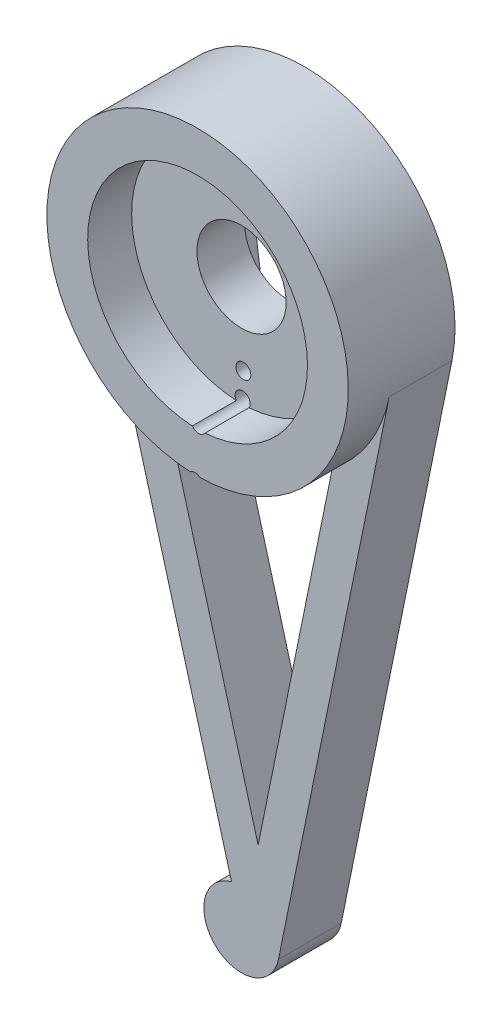
ISO-10303-21;
HEADER;
FILE_DESCRIPTION(('STEP AP214'),'2;1');
FILE_NAME('part.step','',(''),(''),'','','');
FILE_SCHEMA(('AUTOMOTIVE_DESIGN { 1 0 10303 214 1 1 1 1 }'));
ENDSEC;
DATA;
#1=APPLICATION_CONTEXT('core data for automotive mechanical design processes');
#2=APPLICATION_PROTOCOL_DEFINITION('international standard','automotive_design',2000,#1);
#3=PRODUCT_CONTEXT('',#1,'mechanical');
#4=PRODUCT('Part','Part','',(#3));
#5=PRODUCT_RELATED_PRODUCT_CATEGORY('part','',(#4));
#6=PRODUCT_DEFINITION_FORMATION('','',#4);
#7=PRODUCT_DEFINITION_CONTEXT('part definition',#1,'design');
#8=PRODUCT_DEFINITION('design','',#6,#7);
#9=PRODUCT_DEFINITION_SHAPE('','',#8);
#10=(LENGTH_UNIT() NAMED_UNIT(*) SI_UNIT(.MILLI.,.METRE.));
#11=(NAMED_UNIT(*) PLANE_ANGLE_UNIT() SI_UNIT($,.RADIAN.));
#12=(NAMED_UNIT(*) SI_UNIT($,.STERADIAN.) SOLID_ANGLE_UNIT());
#13=UNCERTAINTY_MEASURE_WITH_UNIT(LENGTH_MEASURE(1.E-05),#10,'distance_accuracy_value','');
#14=(GEOMETRIC_REPRESENTATION_CONTEXT(3) GLOBAL_UNCERTAINTY_ASSIGNED_CONTEXT((#13)) GLOBAL_UNIT_ASSIGNED_CONTEXT((#10,
#11,#12)) REPRESENTATION_CONTEXT('',''));
#15=CARTESIAN_POINT('',(0.,0.,0.));
#16=DIRECTION('',(0.,0.,1.));
#17=DIRECTION('',(1.,0.,0.));
#18=AXIS2_PLACEMENT_3D('',#15,#16,#17);
#19=CARTESIAN_POINT('',(0.,0.,5.));
#20=DIRECTION('',(0.,0.,1.));
#21=DIRECTION('',(1.,0.,0.));
#22=AXIS2_PLACEMENT_3D('',#19,#20,#21);
#23=PLANE('',#22);
#24=CARTESIAN_POINT('',(-0.20026757996282,-12.4483891687404,5.));
#25=DIRECTION('',(0.,0.,1.));
#26=DIRECTION('',(1.,0.,0.));
#27=AXIS2_PLACEMENT_3D('',#24,#25,#26);
#28=CIRCLE('',#27,0.600000000000014);
#29=CARTESIAN_POINT('',(0.352635662624541,-12.2153698469312,5.));
#30=VERTEX_POINT('',#29);
#31=CARTESIAN_POINT('',(0.196595474620813,-11.9983894843999,5.));
#32=VERTEX_POINT('',#31);
#33=EDGE_CURVE('E327',#30,#32,#28,.T.);
#34=ORIENTED_EDGE('',*,*,#33,.F.);
#35=CARTESIAN_POINT('',(0.272467701428492,-1.63402512428662,5.));
#36=DIRECTION('',(0.,0.,-1.));
#37=DIRECTION('',(1.,0.,0.));
#38=AXIS2_PLACEMENT_3D('',#35,#36,#37);
#39=CIRCLE('',#38,10.5816484085156);
#40=CARTESIAN_POINT('',(7.22345623636612,-9.61243608315601,5.));
#41=VERTEX_POINT('',#40);
#42=EDGE_CURVE('E225',#41,#30,#39,.T.);
#43=ORIENTED_EDGE('',*,*,#42,.F.);
#44=DIRECTION('',(0.2,0.979795897113271,0.));
#45=VECTOR('',#44,1.);
#46=CARTESIAN_POINT('',(1.32147916649086,-38.5261006727579,5.));
#47=LINE('',#46,#45);
#48=CARTESIAN_POINT('',(1.32147916649086,-38.5261006727579,5.));
#49=VERTEX_POINT('',#48);
#50=EDGE_CURVE('E220',#49,#41,#47,.T.);
#51=ORIENTED_EDGE('',*,*,#50,.F.);
#52=DIRECTION('',(0.266666666666667,-0.963788819653397,0.));
#53=VECTOR('',#52,1.);
#54=CARTESIAN_POINT('',(-6.67852083350914,-9.61243608315601,5.));
#55=LINE('',#54,#53);
#56=CARTESIAN_POINT('',(-6.5574983280289,-10.0498365995621,5.));
#57=VERTEX_POINT('',#56);
#58=EDGE_CURVE('E221',#57,#49,#55,.T.);
#59=ORIENTED_EDGE('',*,*,#58,.F.);
#60=CARTESIAN_POINT('',(0.,0.,5.));
#61=DIRECTION('',(0.,0.,1.));
#62=DIRECTION('',(1.,0.,0.));
#63=AXIS2_PLACEMENT_3D('',#60,#61,#62);
#64=CIRCLE('',#63,12.);
#65=CARTESIAN_POINT('',(-11.5654658358408,-3.2,5.));
#66=VERTEX_POINT('',#65);
#67=EDGE_CURVE('E175',#66,#57,#64,.T.);
#68=ORIENTED_EDGE('',*,*,#67,.F.);
#69=DIRECTION('',(0.266666666666667,-0.963788819653397,0.));
#70=VECTOR('',#69,1.);
#71=CARTESIAN_POINT('',(-11.5654658358408,-3.2,5.));
#72=LINE('',#71,#70);
#73=CARTESIAN_POINT('',(-0.799999999999995,-42.1086335410398,5.));
#74=VERTEX_POINT('',#73);
#75=EDGE_CURVE('E247',#66,#74,#72,.T.);
#76=ORIENTED_EDGE('',*,*,#75,.T.);
#77=CARTESIAN_POINT('',(0.,-45.,5.));
#78=DIRECTION('',(0.,0.,1.));
#79=DIRECTION('',(1.,0.,0.));
#80=AXIS2_PLACEMENT_3D('',#77,#78,#79);
#81=CIRCLE('',#80,3.);
#82=CARTESIAN_POINT('',(2.93938769133982,-45.6,5.));
#83=VERTEX_POINT('',#82);
#84=EDGE_CURVE('E249',#74,#83,#81,.T.);
#85=ORIENTED_EDGE('',*,*,#84,.T.);
#86=DIRECTION('',(0.2,0.979795897113271,0.));
#87=VECTOR('',#86,1.);
#88=CARTESIAN_POINT('',(2.93938769133982,-45.6,5.));
#89=LINE('',#88,#87);
#90=CARTESIAN_POINT('',(11.7575507653593,-2.4,5.));
#91=VERTEX_POINT('',#90);
#92=EDGE_CURVE('E252',#83,#91,#89,.T.);
#93=ORIENTED_EDGE('',*,*,#92,.T.);
#94=EDGE_CURVE('E178',#32,#91,#64,.T.);
#95=ORIENTED_EDGE('',*,*,#94,.F.);
#96=EDGE_LOOP('',(#34,#43,#51,#59,#68,#76,#85,#93,#95));
#97=FACE_BOUND('',#96,.T.);
#98=ADVANCED_FACE('F34',(#97),#23,.T.);
#99=CARTESIAN_POINT('',(0.272467701428492,-1.63402512428662,5.));
#100=DIRECTION('',(0.,0.,-1.));
#101=DIRECTION('',(-1.,0.,0.));
#102=AXIS2_PLACEMENT_3D('',#99,#100,#101);
#103=CYLINDRICAL_SURFACE('',#102,10.5816484085156);
#104=DIRECTION('',(0.,0.,-1.));
#105=VECTOR('',#104,1.);
#106=CARTESIAN_POINT('',(-0.730728392479646,-12.1680120541536,4.25));
#107=LINE('',#106,#105);
#108=CARTESIAN_POINT('',(-0.730728392479647,-12.1680120541536,5.));
#109=VERTEX_POINT('',#108);
#110=CARTESIAN_POINT('',(-0.730728392479643,-12.1680120541536,1.2));
#111=VERTEX_POINT('',#110);
#112=EDGE_CURVE('E322',#109,#111,#107,.T.);
#113=ORIENTED_EDGE('',*,*,#112,.F.);
#114=CARTESIAN_POINT('',(-4.01235483443582,-11.3093328133263,5.));
#115=VERTEX_POINT('',#114);
#116=EDGE_CURVE('E229',#109,#115,#39,.T.);
#117=ORIENTED_EDGE('',*,*,#116,.T.);
#118=CARTESIAN_POINT('',(-6.67852083350914,-9.61243608315601,5.));
#119=VERTEX_POINT('',#118);
#120=EDGE_CURVE('E224',#115,#119,#39,.T.);
#121=ORIENTED_EDGE('',*,*,#120,.T.);
#122=DIRECTION('',(0.,0.,-1.));
#123=VECTOR('',#122,1.);
#124=CARTESIAN_POINT('',(-6.67852083350914,-9.61243608315601,5.));
#125=LINE('',#124,#123);
#126=CARTESIAN_POINT('',(-6.67852083350914,-9.61243608315601,0.));
#127=VERTEX_POINT('',#126);
#128=EDGE_CURVE('E228',#119,#127,#125,.T.);
#129=ORIENTED_EDGE('',*,*,#128,.T.);
#130=CARTESIAN_POINT('',(0.272467701428492,-1.63402512428662,0.));
#131=DIRECTION('',(0.,0.,-1.));
#132=DIRECTION('',(1.,0.,0.));
#133=AXIS2_PLACEMENT_3D('',#130,#131,#132);
#134=CIRCLE('',#133,10.5816484085156);
#135=CARTESIAN_POINT('',(-2.44017887292403,-11.8620665596786,0.));
#136=VERTEX_POINT('',#135);
#137=EDGE_CURVE('E235',#136,#127,#134,.T.);
#138=ORIENTED_EDGE('',*,*,#137,.F.);
#139=DIRECTION('',(0.,0.,-1.));
#140=VECTOR('',#139,1.);
#141=CARTESIAN_POINT('',(-2.44017887292403,-11.8620665596786,5.));
#142=LINE('',#141,#140);
#143=CARTESIAN_POINT('',(-2.44017887292403,-11.8620665596786,1.2));
#144=VERTEX_POINT('',#143);
#145=EDGE_CURVE('E274',#144,#136,#142,.T.);
#146=ORIENTED_EDGE('',*,*,#145,.F.);
#147=CARTESIAN_POINT('',(0.272467701428492,-1.63402512428662,1.2));
#148=DIRECTION('',(0.,0.,-1.));
#149=DIRECTION('',(-1.,0.,0.));
#150=AXIS2_PLACEMENT_3D('',#147,#148,#149);
#151=CIRCLE('',#150,10.5816484085156);
#152=EDGE_CURVE('E209',#144,#111,#151,.F.);
#153=ORIENTED_EDGE('',*,*,#152,.T.);
#154=EDGE_LOOP('',(#113,#117,#121,#129,#138,#146,#153));
#155=FACE_BOUND('',#154,.T.);
#156=ADVANCED_FACE('F321',(#155),#103,.T.);
#157=CARTESIAN_POINT('',(0.141802358091718,-6.41402587353255,5.));
#158=DIRECTION('',(0.,0.,1.));
#159=DIRECTION('',(1.,0.,0.));
#160=AXIS2_PLACEMENT_3D('',#157,#158,#159);
#161=CIRCLE('',#160,0.600000000000014);
#162=CARTESIAN_POINT('',(0.741802358091732,-6.41402587353255,5.));
#163=VERTEX_POINT('',#162);
#164=EDGE_CURVE('E179',#163,#163,#161,.T.);
#165=ORIENTED_EDGE('',*,*,#164,.F.);
#166=EDGE_LOOP('',(#165));
#167=FACE_BOUND('',#166,.T.);
#168=CARTESIAN_POINT('',(0.0861771780077113,-8.41402587353255,5.));
#169=DIRECTION('',(0.,0.,1.));
#170=DIRECTION('',(1.,0.,0.));
#171=AXIS2_PLACEMENT_3D('',#168,#169,#170);
#172=CIRCLE('',#171,0.600000000000013);
#173=CARTESIAN_POINT('',(0.596454671997415,-8.72964729094209,5.));
#174=VERTEX_POINT('',#173);
#175=CARTESIAN_POINT('',(-0.417528705285574,-8.74003259606408,5.));
#176=VERTEX_POINT('',#175);
#177=EDGE_CURVE('E159',#174,#176,#172,.T.);
#178=ORIENTED_EDGE('',*,*,#177,.F.);
#179=CARTESIAN_POINT('',(0.,0.,5.));
#180=DIRECTION('',(0.,0.,1.));
#181=DIRECTION('',(1.,0.,0.));
#182=AXIS2_PLACEMENT_3D('',#179,#180,#181);
#183=CIRCLE('',#182,8.75);
#184=EDGE_CURVE('E172',#174,#176,#183,.T.);
#185=ORIENTED_EDGE('',*,*,#184,.T.);
#186=EDGE_LOOP('',(#178,#185));
#187=FACE_BOUND('',#186,.T.);
#188=CARTESIAN_POINT('',(0.,0.,5.));
#189=DIRECTION('',(0.,0.,1.));
#190=DIRECTION('',(1.,0.,0.));
#191=AXIS2_PLACEMENT_3D('',#188,#189,#190);
#192=CIRCLE('',#191,3.55);
#193=CARTESIAN_POINT('',(3.55,0.,5.));
#194=VERTEX_POINT('',#193);
#195=EDGE_CURVE('E212',#194,#194,#192,.T.);
#196=ORIENTED_EDGE('',*,*,#195,.F.);
#197=EDGE_LOOP('',(#196));
#198=FACE_BOUND('',#197,.T.);
#199=ADVANCED_FACE('F342',(#167,#187,#198),#23,.T.);
#200=CARTESIAN_POINT('',(0.,0.,5.));
#201=DIRECTION('',(0.,0.,-1.));
#202=DIRECTION('',(-1.,0.,0.));
#203=AXIS2_PLACEMENT_3D('',#200,#201,#202);
#204=CYLINDRICAL_SURFACE('',#203,3.55);
#205=ORIENTED_EDGE('',*,*,#195,.T.);
#206=EDGE_LOOP('',(#205));
#207=FACE_BOUND('',#206,.T.);
#208=CARTESIAN_POINT('',(0.,0.,1.2));
#209=DIRECTION('',(0.,0.,-1.));
#210=DIRECTION('',(-1.,0.,0.));
#211=AXIS2_PLACEMENT_3D('',#208,#209,#210);
#212=CIRCLE('',#211,3.55);
#213=CARTESIAN_POINT('',(-3.55,0.,1.2));
#214=VERTEX_POINT('',#213);
#215=EDGE_CURVE('E206',#214,#214,#212,.T.);
#216=ORIENTED_EDGE('',*,*,#215,.T.);
#217=EDGE_LOOP('',(#216));
#218=FACE_BOUND('',#217,.T.);
#219=ADVANCED_FACE('F345',(#207,#218),#204,.F.);
#220=CARTESIAN_POINT('',(-0.582449965671261,-11.9858563330907,5.));
#221=VERTEX_POINT('',#220);
#222=EDGE_CURVE('E326',#221,#109,#28,.T.);
#223=ORIENTED_EDGE('',*,*,#222,.F.);
#224=EDGE_CURVE('E177',#115,#221,#64,.T.);
#225=ORIENTED_EDGE('',*,*,#224,.F.);
#226=ORIENTED_EDGE('',*,*,#116,.F.);
#227=EDGE_LOOP('',(#223,#225,#226));
#228=FACE_BOUND('',#227,.T.);
#229=ADVANCED_FACE('F325',(#228),#23,.T.);
#230=CARTESIAN_POINT('',(0.,0.,0.));
#231=DIRECTION('',(0.,0.,1.));
#232=DIRECTION('',(1.,0.,0.));
#233=AXIS2_PLACEMENT_3D('',#230,#231,#232);
#234=PLANE('',#233);
#235=CARTESIAN_POINT('',(0.,0.,0.));
#236=DIRECTION('',(0.,0.,1.));
#237=DIRECTION('',(1.,0.,0.));
#238=AXIS2_PLACEMENT_3D('',#235,#236,#237);
#239=CIRCLE('',#238,12.);
#240=CARTESIAN_POINT('',(11.7575507653593,-2.4,0.));
#241=VERTEX_POINT('',#240);
#242=CARTESIAN_POINT('',(-11.5654658358408,-3.2,0.));
#243=VERTEX_POINT('',#242);
#244=EDGE_CURVE('E246',#241,#243,#239,.T.);
#245=ORIENTED_EDGE('',*,*,#244,.F.);
#246=DIRECTION('',(0.2,0.979795897113271,0.));
#247=VECTOR('',#246,1.);
#248=CARTESIAN_POINT('',(2.93938769133982,-45.6,0.));
#249=LINE('',#248,#247);
#250=CARTESIAN_POINT('',(2.93938769133982,-45.6,0.));
#251=VERTEX_POINT('',#250);
#252=EDGE_CURVE('E250',#251,#241,#249,.T.);
#253=ORIENTED_EDGE('',*,*,#252,.F.);
#254=CARTESIAN_POINT('',(0.,-45.,0.));
#255=DIRECTION('',(0.,0.,1.));
#256=DIRECTION('',(1.,0.,0.));
#257=AXIS2_PLACEMENT_3D('',#254,#255,#256);
#258=CIRCLE('',#257,3.);
#259=CARTESIAN_POINT('',(-0.799999999999995,-42.1086335410398,0.));
#260=VERTEX_POINT('',#259);
#261=EDGE_CURVE('E260',#260,#251,#258,.T.);
#262=ORIENTED_EDGE('',*,*,#261,.F.);
#263=DIRECTION('',(0.266666666666667,-0.963788819653397,0.));
#264=VECTOR('',#263,1.);
#265=CARTESIAN_POINT('',(-11.5654658358408,-3.2,0.));
#266=LINE('',#265,#264);
#267=EDGE_CURVE('E258',#243,#260,#266,.T.);
#268=ORIENTED_EDGE('',*,*,#267,.F.);
#269=EDGE_LOOP('',(#245,#253,#262,#268));
#270=FACE_BOUND('',#269,.T.);
#271=CARTESIAN_POINT('',(7.22345623636612,-9.61243608315601,0.));
#272=VERTEX_POINT('',#271);
#273=CARTESIAN_POINT('',(2.42229655844765,-11.9949864178621,0.));
#274=VERTEX_POINT('',#273);
#275=EDGE_CURVE('E236',#272,#274,#134,.T.);
#276=ORIENTED_EDGE('',*,*,#275,.T.);
#277=DIRECTION('',(-0.133333333333333,-0.991071249821234,0.));
#278=VECTOR('',#277,1.);
#279=CARTESIAN_POINT('',(1.98214249964247,-15.2666666666667,0.));
#280=LINE('',#279,#278);
#281=CARTESIAN_POINT('',(3.96428499928493,-0.533333333333333,0.));
#282=VERTEX_POINT('',#281);
#283=EDGE_CURVE('E192',#282,#274,#280,.T.);
#284=ORIENTED_EDGE('',*,*,#283,.F.);
#285=CARTESIAN_POINT('',(0.,0.,0.));
#286=DIRECTION('',(0.,0.,-1.));
#287=DIRECTION('',(-1.,0.,0.));
#288=AXIS2_PLACEMENT_3D('',#285,#286,#287);
#289=CIRCLE('',#288,4.);
#290=CARTESIAN_POINT('',(-3.96428499928494,-0.533333333333334,0.));
#291=VERTEX_POINT('',#290);
#292=EDGE_CURVE('E200',#291,#282,#289,.T.);
#293=ORIENTED_EDGE('',*,*,#292,.F.);
#294=DIRECTION('',(-0.133333333333333,0.991071249821234,0.));
#295=VECTOR('',#294,1.);
#296=CARTESIAN_POINT('',(-3.96428499928493,-0.533333333333333,0.));
#297=LINE('',#296,#295);
#298=EDGE_CURVE('E186',#136,#291,#297,.T.);
#299=ORIENTED_EDGE('',*,*,#298,.F.);
#300=ORIENTED_EDGE('',*,*,#137,.T.);
#301=DIRECTION('',(0.266666666666667,-0.963788819653397,0.));
#302=VECTOR('',#301,1.);
#303=CARTESIAN_POINT('',(-6.67852083350914,-9.61243608315601,0.));
#304=LINE('',#303,#302);
#305=CARTESIAN_POINT('',(1.32147916649086,-38.5261006727579,0.));
#306=VERTEX_POINT('',#305);
#307=EDGE_CURVE('E216',#127,#306,#304,.T.);
#308=ORIENTED_EDGE('',*,*,#307,.T.);
#309=DIRECTION('',(0.2,0.979795897113271,0.));
#310=VECTOR('',#309,1.);
#311=CARTESIAN_POINT('',(1.32147916649086,-38.5261006727579,0.));
#312=LINE('',#311,#310);
#313=EDGE_CURVE('E232',#306,#272,#312,.T.);
#314=ORIENTED_EDGE('',*,*,#313,.T.);
#315=EDGE_LOOP('',(#276,#284,#293,#299,#300,#308,#314));
#316=FACE_BOUND('',#315,.T.);
#317=ADVANCED_FACE('F299',(#270,#316),#234,.F.);
#318=CARTESIAN_POINT('',(0.,0.,5.));
#319=DIRECTION('',(0.,0.,-1.));
#320=DIRECTION('',(-1.,0.,0.));
#321=AXIS2_PLACEMENT_3D('',#318,#319,#320);
#322=CYLINDRICAL_SURFACE('',#321,12.);
#323=ORIENTED_EDGE('',*,*,#224,.T.);
#324=DIRECTION('',(0.,0.,-1.));
#325=VECTOR('',#324,1.);
#326=CARTESIAN_POINT('',(-0.58244996567128,-11.9858563330906,4.25));
#327=LINE('',#326,#325);
#328=CARTESIAN_POINT('',(-0.58244996567128,-11.9858563330906,8.5));
#329=VERTEX_POINT('',#328);
#330=EDGE_CURVE('E333',#221,#329,#327,.F.);
#331=ORIENTED_EDGE('',*,*,#330,.T.);
#332=CARTESIAN_POINT('',(0.,0.,8.5));
#333=DIRECTION('',(0.,0.,1.));
#334=DIRECTION('',(1.,0.,0.));
#335=AXIS2_PLACEMENT_3D('',#332,#333,#334);
#336=CIRCLE('',#335,12.);
#337=CARTESIAN_POINT('',(0.196595474620813,-11.9983894843999,8.5));
#338=VERTEX_POINT('',#337);
#339=EDGE_CURVE('E184',#338,#329,#336,.T.);
#340=ORIENTED_EDGE('',*,*,#339,.F.);
#341=DIRECTION('',(0.,0.,-1.));
#342=VECTOR('',#341,1.);
#343=CARTESIAN_POINT('',(0.196595474620832,-11.9983894843999,4.25));
#344=LINE('',#343,#342);
#345=EDGE_CURVE('E50',#338,#32,#344,.T.);
#346=ORIENTED_EDGE('',*,*,#345,.T.);
#347=ORIENTED_EDGE('',*,*,#94,.T.);
#348=DIRECTION('',(0.,0.,-1.));
#349=VECTOR('',#348,1.);
#350=CARTESIAN_POINT('',(11.7575507653593,-2.4,5.));
#351=LINE('',#350,#349);
#352=EDGE_CURVE('E255',#91,#241,#351,.T.);
#353=ORIENTED_EDGE('',*,*,#352,.T.);
#354=ORIENTED_EDGE('',*,*,#244,.T.);
#355=DIRECTION('',(0.,0.,-1.));
#356=VECTOR('',#355,1.);
#357=CARTESIAN_POINT('',(-11.5654658358408,-3.2,5.));
#358=LINE('',#357,#356);
#359=EDGE_CURVE('E271',#66,#243,#358,.T.);
#360=ORIENTED_EDGE('',*,*,#359,.F.);
#361=ORIENTED_EDGE('',*,*,#67,.T.);
#362=EDGE_CURVE('E171',#57,#115,#64,.T.);
#363=ORIENTED_EDGE('',*,*,#362,.T.);
#364=EDGE_LOOP('',(#323,#331,#340,#346,#347,#353,#354,#360,#361,#363));
#365=FACE_BOUND('',#364,.T.);
#366=ADVANCED_FACE('F36',(#365),#322,.T.);
#367=CARTESIAN_POINT('',(-11.5654658358408,-3.2,5.));
#368=DIRECTION('',(0.963788819653397,0.266666666666667,0.));
#369=DIRECTION('',(-0.266666666666667,0.963788819653397,0.));
#370=AXIS2_PLACEMENT_3D('',#367,#368,#369);
#371=PLANE('',#370);
#372=ORIENTED_EDGE('',*,*,#267,.T.);
#373=DIRECTION('',(0.,0.,-1.));
#374=VECTOR('',#373,1.);
#375=CARTESIAN_POINT('',(-0.799999999999995,-42.1086335410398,5.));
#376=LINE('',#375,#374);
#377=EDGE_CURVE('E268',#74,#260,#376,.T.);
#378=ORIENTED_EDGE('',*,*,#377,.F.);
#379=ORIENTED_EDGE('',*,*,#75,.F.);
#380=ORIENTED_EDGE('',*,*,#359,.T.);
#381=EDGE_LOOP('',(#372,#378,#379,#380));
#382=FACE_BOUND('',#381,.T.);
#383=ADVANCED_FACE('F305',(#382),#371,.F.);
#384=CARTESIAN_POINT('',(0.,-45.,5.));
#385=DIRECTION('',(0.,0.,-1.));
#386=DIRECTION('',(-1.,0.,0.));
#387=AXIS2_PLACEMENT_3D('',#384,#385,#386);
#388=CYLINDRICAL_SURFACE('',#387,3.);
#389=ORIENTED_EDGE('',*,*,#261,.T.);
#390=DIRECTION('',(0.,0.,-1.));
#391=VECTOR('',#390,1.);
#392=CARTESIAN_POINT('',(2.93938769133982,-45.6,5.));
#393=LINE('',#392,#391);
#394=EDGE_CURVE('E265',#83,#251,#393,.T.);
#395=ORIENTED_EDGE('',*,*,#394,.F.);
#396=ORIENTED_EDGE('',*,*,#84,.F.);
#397=ORIENTED_EDGE('',*,*,#377,.T.);
#398=EDGE_LOOP('',(#389,#395,#396,#397));
#399=FACE_BOUND('',#398,.T.);
#400=ADVANCED_FACE('F390',(#399),#388,.T.);
#401=CARTESIAN_POINT('',(2.93938769133982,-45.6,5.));
#402=DIRECTION('',(-0.979795897113271,0.2,0.));
#403=DIRECTION('',(-0.2,-0.979795897113271,0.));
#404=AXIS2_PLACEMENT_3D('',#401,#402,#403);
#405=PLANE('',#404);
#406=ORIENTED_EDGE('',*,*,#252,.T.);
#407=ORIENTED_EDGE('',*,*,#352,.F.);
#408=ORIENTED_EDGE('',*,*,#92,.F.);
#409=ORIENTED_EDGE('',*,*,#394,.T.);
#410=EDGE_LOOP('',(#406,#407,#408,#409));
#411=FACE_BOUND('',#410,.T.);
#412=ADVANCED_FACE('F295',(#411),#405,.F.);
#413=CARTESIAN_POINT('',(-6.67852083350914,-9.61243608315601,5.));
#414=DIRECTION('',(0.963788819653397,0.266666666666667,0.));
#415=DIRECTION('',(-0.266666666666667,0.963788819653397,0.));
#416=AXIS2_PLACEMENT_3D('',#413,#414,#415);
#417=PLANE('',#416);
#418=ORIENTED_EDGE('',*,*,#307,.F.);
#419=ORIENTED_EDGE('',*,*,#128,.F.);
#420=EDGE_CURVE('E217',#119,#57,#55,.T.);
#421=ORIENTED_EDGE('',*,*,#420,.T.);
#422=ORIENTED_EDGE('',*,*,#58,.T.);
#423=DIRECTION('',(0.,0.,-1.));
#424=VECTOR('',#423,1.);
#425=CARTESIAN_POINT('',(1.32147916649086,-38.5261006727579,5.));
#426=LINE('',#425,#424);
#427=EDGE_CURVE('E243',#49,#306,#426,.T.);
#428=ORIENTED_EDGE('',*,*,#427,.T.);
#429=EDGE_LOOP('',(#418,#419,#421,#422,#428));
#430=FACE_BOUND('',#429,.T.);
#431=ADVANCED_FACE('F314',(#430),#417,.T.);
#432=CARTESIAN_POINT('',(1.32147916649086,-38.5261006727579,5.));
#433=DIRECTION('',(-0.979795897113271,0.2,0.));
#434=DIRECTION('',(-0.2,-0.979795897113271,0.));
#435=AXIS2_PLACEMENT_3D('',#432,#433,#434);
#436=PLANE('',#435);
#437=ORIENTED_EDGE('',*,*,#313,.F.);
#438=ORIENTED_EDGE('',*,*,#427,.F.);
#439=ORIENTED_EDGE('',*,*,#50,.T.);
#440=DIRECTION('',(0.,0.,-1.));
#441=VECTOR('',#440,1.);
#442=CARTESIAN_POINT('',(7.22345623636612,-9.61243608315601,5.));
#443=LINE('',#442,#441);
#444=EDGE_CURVE('E241',#41,#272,#443,.T.);
#445=ORIENTED_EDGE('',*,*,#444,.T.);
#446=EDGE_LOOP('',(#437,#438,#439,#445));
#447=FACE_BOUND('',#446,.T.);
#448=ADVANCED_FACE('F414',(#447),#436,.T.);
#449=DIRECTION('',(0.,0.,-1.));
#450=VECTOR('',#449,1.);
#451=CARTESIAN_POINT('',(0.352635662624538,-12.2153698469312,4.25));
#452=LINE('',#451,#450);
#453=CARTESIAN_POINT('',(0.352635662624534,-12.2153698469312,1.2));
#454=VERTEX_POINT('',#453);
#455=EDGE_CURVE('E329',#454,#30,#452,.F.);
#456=ORIENTED_EDGE('',*,*,#455,.F.);
#457=CARTESIAN_POINT('',(2.42229655844765,-11.9949864178621,1.2));
#458=VERTEX_POINT('',#457);
#459=EDGE_CURVE('E213',#454,#458,#151,.F.);
#460=ORIENTED_EDGE('',*,*,#459,.T.);
#461=DIRECTION('',(0.,0.,-1.));
#462=VECTOR('',#461,1.);
#463=CARTESIAN_POINT('',(2.42229655844765,-11.9949864178621,5.));
#464=LINE('',#463,#462);
#465=EDGE_CURVE('E278',#274,#458,#464,.F.);
#466=ORIENTED_EDGE('',*,*,#465,.F.);
#467=ORIENTED_EDGE('',*,*,#275,.F.);
#468=ORIENTED_EDGE('',*,*,#444,.F.);
#469=ORIENTED_EDGE('',*,*,#42,.T.);
#470=EDGE_LOOP('',(#456,#460,#466,#467,#468,#469));
#471=FACE_BOUND('',#470,.T.);
#472=ADVANCED_FACE('F377',(#471),#103,.T.);
#473=CARTESIAN_POINT('',(1.98214249964247,-15.2666666666667,1.2));
#474=DIRECTION('',(0.991071249821234,-0.133333333333333,0.));
#475=DIRECTION('',(0.133333333333333,0.991071249821234,0.));
#476=AXIS2_PLACEMENT_3D('',#473,#474,#475);
#477=PLANE('',#476);
#478=ORIENTED_EDGE('',*,*,#465,.T.);
#479=DIRECTION('',(-0.133333333333333,-0.991071249821234,0.));
#480=VECTOR('',#479,1.);
#481=CARTESIAN_POINT('',(1.98214249964247,-15.2666666666667,1.2));
#482=LINE('',#481,#480);
#483=CARTESIAN_POINT('',(3.96428499928493,-0.533333333333333,1.2));
#484=VERTEX_POINT('',#483);
#485=EDGE_CURVE('E195',#484,#458,#482,.T.);
#486=ORIENTED_EDGE('',*,*,#485,.F.);
#487=DIRECTION('',(0.,0.,-1.));
#488=VECTOR('',#487,1.);
#489=CARTESIAN_POINT('',(3.96428499928493,-0.533333333333333,1.2));
#490=LINE('',#489,#488);
#491=EDGE_CURVE('E204',#484,#282,#490,.T.);
#492=ORIENTED_EDGE('',*,*,#491,.T.);
#493=ORIENTED_EDGE('',*,*,#283,.T.);
#494=EDGE_LOOP('',(#478,#486,#492,#493));
#495=FACE_BOUND('',#494,.T.);
#496=ADVANCED_FACE('F428',(#495),#477,.F.);
#497=CARTESIAN_POINT('',(0.,0.,1.2));
#498=DIRECTION('',(0.,0.,-1.));
#499=DIRECTION('',(-1.,0.,0.));
#500=AXIS2_PLACEMENT_3D('',#497,#498,#499);
#501=CYLINDRICAL_SURFACE('',#500,4.);
#502=ORIENTED_EDGE('',*,*,#292,.T.);
#503=ORIENTED_EDGE('',*,*,#491,.F.);
#504=CARTESIAN_POINT('',(0.,0.,1.2));
#505=DIRECTION('',(0.,0.,-1.));
#506=DIRECTION('',(-1.,0.,0.));
#507=AXIS2_PLACEMENT_3D('',#504,#505,#506);
#508=CIRCLE('',#507,4.);
#509=CARTESIAN_POINT('',(-3.96428499928494,-0.533333333333334,1.2));
#510=VERTEX_POINT('',#509);
#511=EDGE_CURVE('E191',#510,#484,#508,.T.);
#512=ORIENTED_EDGE('',*,*,#511,.F.);
#513=DIRECTION('',(0.,0.,-1.));
#514=VECTOR('',#513,1.);
#515=CARTESIAN_POINT('',(-3.96428499928494,-0.533333333333334,1.2));
#516=LINE('',#515,#514);
#517=EDGE_CURVE('E198',#510,#291,#516,.T.);
#518=ORIENTED_EDGE('',*,*,#517,.T.);
#519=EDGE_LOOP('',(#502,#503,#512,#518));
#520=FACE_BOUND('',#519,.T.);
#521=ADVANCED_FACE('F366',(#520),#501,.F.);
#522=CARTESIAN_POINT('',(-3.96428499928493,-0.533333333333333,1.2));
#523=DIRECTION('',(-0.991071249821234,-0.133333333333333,0.));
#524=DIRECTION('',(0.133333333333333,-0.991071249821234,0.));
#525=AXIS2_PLACEMENT_3D('',#522,#523,#524);
#526=PLANE('',#525);
#527=ORIENTED_EDGE('',*,*,#145,.T.);
#528=ORIENTED_EDGE('',*,*,#298,.T.);
#529=ORIENTED_EDGE('',*,*,#517,.F.);
#530=DIRECTION('',(-0.133333333333333,0.991071249821234,0.));
#531=VECTOR('',#530,1.);
#532=CARTESIAN_POINT('',(-3.96428499928493,-0.533333333333333,1.2));
#533=LINE('',#532,#531);
#534=EDGE_CURVE('E189',#144,#510,#533,.T.);
#535=ORIENTED_EDGE('',*,*,#534,.F.);
#536=EDGE_LOOP('',(#527,#528,#529,#535));
#537=FACE_BOUND('',#536,.T.);
#538=ADVANCED_FACE('F357',(#537),#526,.F.);
#539=CARTESIAN_POINT('',(0.,-15.,1.2));
#540=DIRECTION('',(0.,0.,-1.));
#541=DIRECTION('',(-1.,0.,0.));
#542=AXIS2_PLACEMENT_3D('',#539,#540,#541);
#543=PLANE('',#542);
#544=CARTESIAN_POINT('',(0.141802358091718,-6.41402587353255,1.2));
#545=DIRECTION('',(0.,0.,-1.));
#546=DIRECTION('',(-1.,0.,0.));
#547=AXIS2_PLACEMENT_3D('',#544,#545,#546);
#548=CIRCLE('',#547,0.600000000000014);
#549=CARTESIAN_POINT('',(-0.458197641908295,-6.41402587353255,1.2));
#550=VERTEX_POINT('',#549);
#551=EDGE_CURVE('E38',#550,#550,#548,.T.);
#552=ORIENTED_EDGE('',*,*,#551,.F.);
#553=EDGE_LOOP('',(#552));
#554=FACE_BOUND('',#553,.T.);
#555=CARTESIAN_POINT('',(-0.20026757996282,-12.4483891687404,1.2));
#556=DIRECTION('',(0.,0.,-1.));
#557=DIRECTION('',(-1.,0.,0.));
#558=AXIS2_PLACEMENT_3D('',#555,#556,#557);
#559=CIRCLE('',#558,0.600000000000014);
#560=EDGE_CURVE('E532',#111,#454,#559,.T.);
#561=ORIENTED_EDGE('',*,*,#560,.F.);
#562=ORIENTED_EDGE('',*,*,#152,.F.);
#563=ORIENTED_EDGE('',*,*,#534,.T.);
#564=ORIENTED_EDGE('',*,*,#511,.T.);
#565=ORIENTED_EDGE('',*,*,#485,.T.);
#566=ORIENTED_EDGE('',*,*,#459,.F.);
#567=EDGE_LOOP('',(#561,#562,#563,#564,#565,#566));
#568=FACE_BOUND('',#567,.T.);
#569=CARTESIAN_POINT('',(0.0861771780077113,-8.41402587353255,1.2));
#570=DIRECTION('',(0.,0.,-1.));
#571=DIRECTION('',(-1.,0.,0.));
#572=AXIS2_PLACEMENT_3D('',#569,#570,#571);
#573=CIRCLE('',#572,0.600000000000013);
#574=CARTESIAN_POINT('',(-0.513822821992302,-8.41402587353255,1.2));
#575=VERTEX_POINT('',#574);
#576=EDGE_CURVE('E530',#575,#575,#573,.T.);
#577=ORIENTED_EDGE('',*,*,#576,.F.);
#578=EDGE_LOOP('',(#577));
#579=FACE_BOUND('',#578,.T.);
#580=ORIENTED_EDGE('',*,*,#215,.F.);
#581=EDGE_LOOP('',(#580));
#582=FACE_BOUND('',#581,.T.);
#583=ADVANCED_FACE('F355',(#554,#568,#579,#582),#543,.T.);
#584=CARTESIAN_POINT('',(0.,0.,8.5));
#585=DIRECTION('',(0.,0.,1.));
#586=DIRECTION('',(1.,0.,0.));
#587=AXIS2_PLACEMENT_3D('',#584,#585,#586);
#588=PLANE('',#587);
#589=CARTESIAN_POINT('',(-0.20026757996282,-12.4483891687404,8.5));
#590=DIRECTION('',(0.,0.,-1.));
#591=DIRECTION('',(-1.,0.,0.));
#592=AXIS2_PLACEMENT_3D('',#589,#590,#591);
#593=CIRCLE('',#592,0.600000000000014);
#594=EDGE_CURVE('E168',#329,#338,#593,.T.);
#595=ORIENTED_EDGE('',*,*,#594,.T.);
#596=ORIENTED_EDGE('',*,*,#339,.T.);
#597=EDGE_LOOP('',(#595,#596));
#598=FACE_BOUND('',#597,.T.);
#599=CARTESIAN_POINT('',(0.0861771780077113,-8.41402587353255,8.5));
#600=DIRECTION('',(0.,0.,-1.));
#601=DIRECTION('',(-1.,0.,0.));
#602=AXIS2_PLACEMENT_3D('',#599,#600,#601);
#603=CIRCLE('',#602,0.600000000000013);
#604=CARTESIAN_POINT('',(0.596454671997412,-8.72964729094209,8.5));
#605=VERTEX_POINT('',#604);
#606=CARTESIAN_POINT('',(-0.41752870528557,-8.74003259606408,8.5));
#607=VERTEX_POINT('',#606);
#608=EDGE_CURVE('E57',#605,#607,#603,.T.);
#609=ORIENTED_EDGE('',*,*,#608,.T.);
#610=CARTESIAN_POINT('',(0.,0.,8.5));
#611=DIRECTION('',(0.,0.,1.));
#612=DIRECTION('',(1.,0.,0.));
#613=AXIS2_PLACEMENT_3D('',#610,#611,#612);
#614=CIRCLE('',#613,8.75);
#615=EDGE_CURVE('E167',#605,#607,#614,.T.);
#616=ORIENTED_EDGE('',*,*,#615,.F.);
#617=EDGE_LOOP('',(#609,#616));
#618=FACE_BOUND('',#617,.T.);
#619=ADVANCED_FACE('F166',(#598,#618),#588,.T.);
#620=CARTESIAN_POINT('',(0.,0.,5.));
#621=DIRECTION('',(0.,0.,1.));
#622=DIRECTION('',(1.,0.,0.));
#623=AXIS2_PLACEMENT_3D('',#620,#621,#622);
#624=PLANE('',#623);
#625=ORIENTED_EDGE('',*,*,#420,.F.);
#626=ORIENTED_EDGE('',*,*,#120,.F.);
#627=ORIENTED_EDGE('',*,*,#362,.F.);
#628=EDGE_LOOP('',(#625,#626,#627));
#629=FACE_BOUND('',#628,.T.);
#630=ADVANCED_FACE('F317',(#629),#624,.F.);
#631=CARTESIAN_POINT('',(0.,0.,8.5));
#632=DIRECTION('',(0.,0.,-1.));
#633=DIRECTION('',(-1.,0.,0.));
#634=AXIS2_PLACEMENT_3D('',#631,#632,#633);
#635=CYLINDRICAL_SURFACE('',#634,8.75);
#636=DIRECTION('',(0.,0.,-1.));
#637=VECTOR('',#636,1.);
#638=CARTESIAN_POINT('',(-0.417528705285571,-8.74003259606408,4.25));
#639=LINE('',#638,#637);
#640=EDGE_CURVE('E11',#176,#607,#639,.F.);
#641=ORIENTED_EDGE('',*,*,#640,.F.);
#642=ORIENTED_EDGE('',*,*,#184,.F.);
#643=DIRECTION('',(0.,0.,-1.));
#644=VECTOR('',#643,1.);
#645=CARTESIAN_POINT('',(0.596454671997413,-8.72964729094208,4.25));
#646=LINE('',#645,#644);
#647=EDGE_CURVE('E43',#605,#174,#646,.T.);
#648=ORIENTED_EDGE('',*,*,#647,.F.);
#649=ORIENTED_EDGE('',*,*,#615,.T.);
#650=EDGE_LOOP('',(#641,#642,#648,#649));
#651=FACE_BOUND('',#650,.T.);
#652=ADVANCED_FACE('F170',(#651),#635,.F.);
#653=CARTESIAN_POINT('',(0.0861771780077113,-8.41402587353255,8.5));
#654=DIRECTION('',(0.,0.,-1.));
#655=DIRECTION('',(-1.,0.,0.));
#656=AXIS2_PLACEMENT_3D('',#653,#654,#655);
#657=CYLINDRICAL_SURFACE('',#656,0.600000000000013);
#658=ORIENTED_EDGE('',*,*,#576,.T.);
#659=EDGE_LOOP('',(#658));
#660=FACE_BOUND('',#659,.T.);
#661=ORIENTED_EDGE('',*,*,#640,.T.);
#662=ORIENTED_EDGE('',*,*,#608,.F.);
#663=ORIENTED_EDGE('',*,*,#647,.T.);
#664=ORIENTED_EDGE('',*,*,#177,.T.);
#665=EDGE_LOOP('',(#661,#662,#663,#664));
#666=FACE_BOUND('',#665,.T.);
#667=ADVANCED_FACE('F157',(#660,#666),#657,.F.);
#668=CARTESIAN_POINT('',(-0.20026757996282,-12.4483891687404,8.5));
#669=DIRECTION('',(0.,0.,-1.));
#670=DIRECTION('',(-1.,0.,0.));
#671=AXIS2_PLACEMENT_3D('',#668,#669,#670);
#672=CYLINDRICAL_SURFACE('',#671,0.600000000000014);
#673=ORIENTED_EDGE('',*,*,#222,.T.);
#674=ORIENTED_EDGE('',*,*,#112,.T.);
#675=ORIENTED_EDGE('',*,*,#560,.T.);
#676=ORIENTED_EDGE('',*,*,#455,.T.);
#677=ORIENTED_EDGE('',*,*,#33,.T.);
#678=ORIENTED_EDGE('',*,*,#345,.F.);
#679=ORIENTED_EDGE('',*,*,#594,.F.);
#680=ORIENTED_EDGE('',*,*,#330,.F.);
#681=EDGE_LOOP('',(#673,#674,#675,#676,#677,#678,#679,#680));
#682=FACE_BOUND('',#681,.T.);
#683=ADVANCED_FACE('F504',(#682),#672,.F.);
#684=CARTESIAN_POINT('',(0.141802358091718,-6.41402587353255,8.5));
#685=DIRECTION('',(0.,0.,-1.));
#686=DIRECTION('',(-1.,0.,0.));
#687=AXIS2_PLACEMENT_3D('',#684,#685,#686);
#688=CYLINDRICAL_SURFACE('',#687,0.600000000000014);
#689=ORIENTED_EDGE('',*,*,#164,.T.);
#690=EDGE_LOOP('',(#689));
#691=FACE_BOUND('',#690,.T.);
#692=ORIENTED_EDGE('',*,*,#551,.T.);
#693=EDGE_LOOP('',(#692));
#694=FACE_BOUND('',#693,.T.);
#695=ADVANCED_FACE('F340',(#691,#694),#688,.F.);
#696=CLOSED_SHELL('',(#98,#156,#199,#219,#229,#317,#366,#383,#400,#412,#431,#448,#472,#496,#521,
#538,#583,#619,#630,#652,#667,#683,#695));
#697=MANIFOLD_SOLID_BREP('B2',#696);
#698=ADVANCED_BREP_SHAPE_REPRESENTATION('',(#18,#697),#14);
#699=SHAPE_DEFINITION_REPRESENTATION(#9,#698);
ENDSEC;
END-ISO-10303-21;
